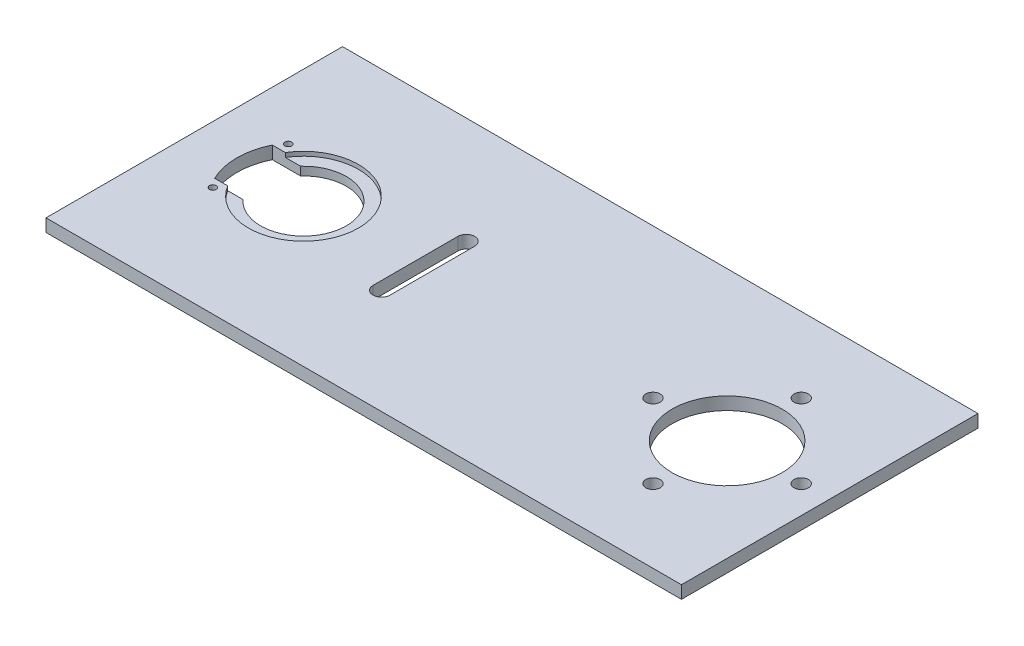
ISO-10303-21;
HEADER;
FILE_DESCRIPTION(('STEP AP214'),'2;1');
FILE_NAME('part.step','',(''),(''),'','','');
FILE_SCHEMA(('AUTOMOTIVE_DESIGN { 1 0 10303 214 1 1 1 1 }'));
ENDSEC;
DATA;
#1=APPLICATION_CONTEXT('core data for automotive mechanical design processes');
#2=APPLICATION_PROTOCOL_DEFINITION('international standard','automotive_design',2000,#1);
#3=PRODUCT_CONTEXT('',#1,'mechanical');
#4=PRODUCT('Part','Part','',(#3));
#5=PRODUCT_RELATED_PRODUCT_CATEGORY('part','',(#4));
#6=PRODUCT_DEFINITION_FORMATION('','',#4);
#7=PRODUCT_DEFINITION_CONTEXT('part definition',#1,'design');
#8=PRODUCT_DEFINITION('design','',#6,#7);
#9=PRODUCT_DEFINITION_SHAPE('','',#8);
#10=(LENGTH_UNIT() NAMED_UNIT(*) SI_UNIT(.MILLI.,.METRE.));
#11=(NAMED_UNIT(*) PLANE_ANGLE_UNIT() SI_UNIT($,.RADIAN.));
#12=(NAMED_UNIT(*) SI_UNIT($,.STERADIAN.) SOLID_ANGLE_UNIT());
#13=UNCERTAINTY_MEASURE_WITH_UNIT(LENGTH_MEASURE(1.E-05),#10,'distance_accuracy_value','');
#14=(GEOMETRIC_REPRESENTATION_CONTEXT(3) GLOBAL_UNCERTAINTY_ASSIGNED_CONTEXT((#13)) GLOBAL_UNIT_ASSIGNED_CONTEXT((#10,
#11,#12)) REPRESENTATION_CONTEXT('',''));
#15=CARTESIAN_POINT('',(0.,0.,0.));
#16=DIRECTION('',(0.,0.,1.));
#17=DIRECTION('',(1.,0.,0.));
#18=AXIS2_PLACEMENT_3D('',#15,#16,#17);
#19=CARTESIAN_POINT('',(25.9787595714161,0.,-34.7957353107245));
#20=DIRECTION('',(0.,1.,0.));
#21=DIRECTION('',(0.,0.,1.));
#22=AXIS2_PLACEMENT_3D('',#19,#20,#21);
#23=CYLINDRICAL_SURFACE('',#22,10.1089267481722);
#24=CARTESIAN_POINT('',(25.9787595714161,2.,-34.7957353107245));
#25=DIRECTION('',(0.,1.,0.));
#26=DIRECTION('',(0.,0.,1.));
#27=AXIS2_PLACEMENT_3D('',#24,#25,#26);
#28=CIRCLE('',#27,10.1089267481722);
#29=CARTESIAN_POINT('',(18.4987595714161,2.,-41.5957353107114));
#30=VERTEX_POINT('',#29);
#31=CARTESIAN_POINT('',(18.4987595714193,2.,-27.9957353107274));
#32=VERTEX_POINT('',#31);
#33=EDGE_CURVE('E239',#30,#32,#28,.F.);
#34=ORIENTED_EDGE('',*,*,#33,.F.);
#35=DIRECTION('',(0.,1.,0.));
#36=VECTOR('',#35,1.);
#37=CARTESIAN_POINT('',(18.4987595714161,0.,-41.5957353107114));
#38=LINE('',#37,#36);
#39=CARTESIAN_POINT('',(18.4987595714161,0.,-41.5957353107114));
#40=VERTEX_POINT('',#39);
#41=EDGE_CURVE('E192',#40,#30,#38,.T.);
#42=ORIENTED_EDGE('',*,*,#41,.F.);
#43=CARTESIAN_POINT('',(25.9787595714161,0.,-34.7957353107245));
#44=DIRECTION('',(0.,1.,0.));
#45=DIRECTION('',(0.,0.,1.));
#46=AXIS2_PLACEMENT_3D('',#43,#44,#45);
#47=CIRCLE('',#46,10.1089267481722);
#48=CARTESIAN_POINT('',(18.4987595714161,0.,-27.9957353107245));
#49=VERTEX_POINT('',#48);
#50=EDGE_CURVE('E180',#49,#40,#47,.T.);
#51=ORIENTED_EDGE('',*,*,#50,.F.);
#52=DIRECTION('',(0.,1.,0.));
#53=VECTOR('',#52,1.);
#54=CARTESIAN_POINT('',(18.4987595714161,0.,-27.9957353107245));
#55=LINE('',#54,#53);
#56=EDGE_CURVE('E181',#49,#32,#55,.T.);
#57=ORIENTED_EDGE('',*,*,#56,.T.);
#58=EDGE_LOOP('',(#34,#42,#51,#57));
#59=FACE_BOUND('',#58,.T.);
#60=ADVANCED_FACE('F39',(#59),#23,.F.);
#61=CARTESIAN_POINT('',(0.,3.,0.));
#62=DIRECTION('',(1.,0.,0.));
#63=DIRECTION('',(0.,0.,-1.));
#64=AXIS2_PLACEMENT_3D('',#61,#62,#63);
#65=PLANE('',#64);
#66=DIRECTION('',(0.,0.,1.));
#67=VECTOR('',#66,1.);
#68=CARTESIAN_POINT('',(0.,0.,0.));
#69=LINE('',#68,#67);
#70=CARTESIAN_POINT('',(0.,0.,-70.));
#71=VERTEX_POINT('',#70);
#72=CARTESIAN_POINT('',(0.,0.,0.));
#73=VERTEX_POINT('',#72);
#74=EDGE_CURVE('E185',#71,#73,#69,.T.);
#75=ORIENTED_EDGE('',*,*,#74,.T.);
#76=DIRECTION('',(0.,-1.,0.));
#77=VECTOR('',#76,1.);
#78=CARTESIAN_POINT('',(0.,3.,0.));
#79=LINE('',#78,#77);
#80=CARTESIAN_POINT('',(0.,3.,0.));
#81=VERTEX_POINT('',#80);
#82=EDGE_CURVE('E232',#81,#73,#79,.T.);
#83=ORIENTED_EDGE('',*,*,#82,.F.);
#84=DIRECTION('',(0.,0.,1.));
#85=VECTOR('',#84,1.);
#86=CARTESIAN_POINT('',(0.,3.,0.));
#87=LINE('',#86,#85);
#88=CARTESIAN_POINT('',(0.,3.,-70.));
#89=VERTEX_POINT('',#88);
#90=EDGE_CURVE('E195',#89,#81,#87,.T.);
#91=ORIENTED_EDGE('',*,*,#90,.F.);
#92=DIRECTION('',(0.,-1.,0.));
#93=VECTOR('',#92,1.);
#94=CARTESIAN_POINT('',(0.,3.,-70.));
#95=LINE('',#94,#93);
#96=EDGE_CURVE('E209',#89,#71,#95,.T.);
#97=ORIENTED_EDGE('',*,*,#96,.T.);
#98=EDGE_LOOP('',(#75,#83,#91,#97));
#99=FACE_BOUND('',#98,.T.);
#100=ADVANCED_FACE('F41',(#99),#65,.F.);
#101=CARTESIAN_POINT('',(0.,3.,0.));
#102=DIRECTION('',(0.,0.,-1.));
#103=DIRECTION('',(-1.,0.,0.));
#104=AXIS2_PLACEMENT_3D('',#101,#102,#103);
#105=PLANE('',#104);
#106=DIRECTION('',(1.,0.,0.));
#107=VECTOR('',#106,1.);
#108=CARTESIAN_POINT('',(0.,0.,0.));
#109=LINE('',#108,#107);
#110=CARTESIAN_POINT('',(150.,0.,0.));
#111=VERTEX_POINT('',#110);
#112=EDGE_CURVE('E213',#73,#111,#109,.T.);
#113=ORIENTED_EDGE('',*,*,#112,.T.);
#114=DIRECTION('',(0.,-1.,0.));
#115=VECTOR('',#114,1.);
#116=CARTESIAN_POINT('',(150.,3.,0.));
#117=LINE('',#116,#115);
#118=CARTESIAN_POINT('',(150.,3.,0.));
#119=VERTEX_POINT('',#118);
#120=EDGE_CURVE('E228',#119,#111,#117,.T.);
#121=ORIENTED_EDGE('',*,*,#120,.F.);
#122=DIRECTION('',(1.,0.,0.));
#123=VECTOR('',#122,1.);
#124=CARTESIAN_POINT('',(0.,3.,0.));
#125=LINE('',#124,#123);
#126=EDGE_CURVE('E199',#81,#119,#125,.T.);
#127=ORIENTED_EDGE('',*,*,#126,.F.);
#128=ORIENTED_EDGE('',*,*,#82,.T.);
#129=EDGE_LOOP('',(#113,#121,#127,#128));
#130=FACE_BOUND('',#129,.T.);
#131=ADVANCED_FACE('F370',(#130),#105,.F.);
#132=CARTESIAN_POINT('',(150.,3.,0.));
#133=DIRECTION('',(-1.,0.,0.));
#134=DIRECTION('',(0.,0.,1.));
#135=AXIS2_PLACEMENT_3D('',#132,#133,#134);
#136=PLANE('',#135);
#137=DIRECTION('',(0.,0.,-1.));
#138=VECTOR('',#137,1.);
#139=CARTESIAN_POINT('',(150.,0.,0.));
#140=LINE('',#139,#138);
#141=CARTESIAN_POINT('',(150.,0.,-70.));
#142=VERTEX_POINT('',#141);
#143=EDGE_CURVE('E216',#111,#142,#140,.T.);
#144=ORIENTED_EDGE('',*,*,#143,.T.);
#145=DIRECTION('',(0.,-1.,0.));
#146=VECTOR('',#145,1.);
#147=CARTESIAN_POINT('',(150.,3.,-70.));
#148=LINE('',#147,#146);
#149=CARTESIAN_POINT('',(150.,3.,-70.));
#150=VERTEX_POINT('',#149);
#151=EDGE_CURVE('E224',#150,#142,#148,.T.);
#152=ORIENTED_EDGE('',*,*,#151,.F.);
#153=DIRECTION('',(0.,0.,-1.));
#154=VECTOR('',#153,1.);
#155=CARTESIAN_POINT('',(150.,3.,0.));
#156=LINE('',#155,#154);
#157=EDGE_CURVE('E203',#119,#150,#156,.T.);
#158=ORIENTED_EDGE('',*,*,#157,.F.);
#159=ORIENTED_EDGE('',*,*,#120,.T.);
#160=EDGE_LOOP('',(#144,#152,#158,#159));
#161=FACE_BOUND('',#160,.T.);
#162=ADVANCED_FACE('F379',(#161),#136,.F.);
#163=CARTESIAN_POINT('',(0.,3.,-70.));
#164=DIRECTION('',(0.,0.,1.));
#165=DIRECTION('',(1.,0.,0.));
#166=AXIS2_PLACEMENT_3D('',#163,#164,#165);
#167=PLANE('',#166);
#168=DIRECTION('',(-1.,0.,0.));
#169=VECTOR('',#168,1.);
#170=CARTESIAN_POINT('',(0.,0.,-70.));
#171=LINE('',#170,#169);
#172=EDGE_CURVE('E200',#142,#71,#171,.T.);
#173=ORIENTED_EDGE('',*,*,#172,.T.);
#174=ORIENTED_EDGE('',*,*,#96,.F.);
#175=DIRECTION('',(-1.,0.,0.));
#176=VECTOR('',#175,1.);
#177=CARTESIAN_POINT('',(0.,3.,-70.));
#178=LINE('',#177,#176);
#179=EDGE_CURVE('E206',#150,#89,#178,.T.);
#180=ORIENTED_EDGE('',*,*,#179,.F.);
#181=ORIENTED_EDGE('',*,*,#151,.T.);
#182=EDGE_LOOP('',(#173,#174,#180,#181));
#183=FACE_BOUND('',#182,.T.);
#184=ADVANCED_FACE('F340',(#183),#167,.F.);
#185=CARTESIAN_POINT('',(0.,3.,0.));
#186=DIRECTION('',(0.,-1.,0.));
#187=DIRECTION('',(0.,0.,-1.));
#188=AXIS2_PLACEMENT_3D('',#185,#186,#187);
#189=PLANE('',#188);
#190=CARTESIAN_POINT('',(125.978759571404,3.,-52.2957353107179));
#191=DIRECTION('',(0.,1.,0.));
#192=DIRECTION('',(0.,0.,1.));
#193=AXIS2_PLACEMENT_3D('',#190,#191,#192);
#194=CIRCLE('',#193,1.70000000000001);
#195=CARTESIAN_POINT('',(125.978759571404,3.,-50.5957353107179));
#196=VERTEX_POINT('',#195);
#197=EDGE_CURVE('E498',#196,#196,#194,.T.);
#198=ORIENTED_EDGE('',*,*,#197,.F.);
#199=EDGE_LOOP('',(#198));
#200=FACE_BOUND('',#199,.T.);
#201=CARTESIAN_POINT('',(108.478759571404,3.,-34.7957353107179));
#202=DIRECTION('',(0.,1.,0.));
#203=DIRECTION('',(0.,0.,1.));
#204=AXIS2_PLACEMENT_3D('',#201,#202,#203);
#205=CIRCLE('',#204,1.69999999999999);
#206=CARTESIAN_POINT('',(108.478759571404,3.,-33.0957353107179));
#207=VERTEX_POINT('',#206);
#208=EDGE_CURVE('E502',#207,#207,#205,.T.);
#209=ORIENTED_EDGE('',*,*,#208,.F.);
#210=EDGE_LOOP('',(#209));
#211=FACE_BOUND('',#210,.T.);
#212=CARTESIAN_POINT('',(125.978759571404,3.,-17.2957353107179));
#213=DIRECTION('',(0.,1.,0.));
#214=DIRECTION('',(0.,0.,1.));
#215=AXIS2_PLACEMENT_3D('',#212,#213,#214);
#216=CIRCLE('',#215,1.70000000000001);
#217=CARTESIAN_POINT('',(125.978759571404,3.,-15.5957353107179));
#218=VERTEX_POINT('',#217);
#219=EDGE_CURVE('E512',#218,#218,#216,.T.);
#220=ORIENTED_EDGE('',*,*,#219,.F.);
#221=EDGE_LOOP('',(#220));
#222=FACE_BOUND('',#221,.T.);
#223=CARTESIAN_POINT('',(143.478759571404,3.,-34.7957353107179));
#224=DIRECTION('',(0.,1.,0.));
#225=DIRECTION('',(0.,0.,1.));
#226=AXIS2_PLACEMENT_3D('',#223,#224,#225);
#227=CIRCLE('',#226,1.70000000000001);
#228=CARTESIAN_POINT('',(143.478759571404,3.,-33.0957353107179));
#229=VERTEX_POINT('',#228);
#230=EDGE_CURVE('E516',#229,#229,#227,.T.);
#231=ORIENTED_EDGE('',*,*,#230,.F.);
#232=EDGE_LOOP('',(#231));
#233=FACE_BOUND('',#232,.T.);
#234=CARTESIAN_POINT('',(13.4987595714161,3.,-25.8957353107245));
#235=DIRECTION('',(0.,1.,0.));
#236=DIRECTION('',(0.,0.,-1.));
#237=AXIS2_PLACEMENT_3D('',#234,#235,#236);
#238=CIRCLE('',#237,0.800000000000006);
#239=CARTESIAN_POINT('',(13.4987595714161,3.,-26.6957353107245));
#240=VERTEX_POINT('',#239);
#241=EDGE_CURVE('E262',#240,#240,#238,.T.);
#242=ORIENTED_EDGE('',*,*,#241,.F.);
#243=EDGE_LOOP('',(#242));
#244=FACE_BOUND('',#243,.T.);
#245=CARTESIAN_POINT('',(13.4987595714161,3.,-43.6957353107114));
#246=DIRECTION('',(0.,1.,0.));
#247=DIRECTION('',(0.,0.,1.));
#248=AXIS2_PLACEMENT_3D('',#245,#246,#247);
#249=CIRCLE('',#248,0.800000000000006);
#250=CARTESIAN_POINT('',(13.4987595714161,3.,-42.8957353107114));
#251=VERTEX_POINT('',#250);
#252=EDGE_CURVE('E324',#251,#251,#249,.T.);
#253=ORIENTED_EDGE('',*,*,#252,.F.);
#254=EDGE_LOOP('',(#253));
#255=FACE_BOUND('',#254,.T.);
#256=DIRECTION('',(0.,0.,1.));
#257=VECTOR('',#256,1.);
#258=CARTESIAN_POINT('',(52.40419960801,3.,-44.7957353107179));
#259=LINE('',#258,#257);
#260=CARTESIAN_POINT('',(52.40419960801,3.,-44.7957353107179));
#261=VERTEX_POINT('',#260);
#262=CARTESIAN_POINT('',(52.40419960801,3.,-24.7957353107179));
#263=VERTEX_POINT('',#262);
#264=EDGE_CURVE('E299',#261,#263,#259,.T.);
#265=ORIENTED_EDGE('',*,*,#264,.F.);
#266=CARTESIAN_POINT('',(54.40419960801,3.,-44.7957353107179));
#267=DIRECTION('',(0.,1.,0.));
#268=DIRECTION('',(0.,0.,1.));
#269=AXIS2_PLACEMENT_3D('',#266,#267,#268);
#270=CIRCLE('',#269,2.);
#271=CARTESIAN_POINT('',(56.40419960801,3.,-44.7957353107179));
#272=VERTEX_POINT('',#271);
#273=EDGE_CURVE('E64',#272,#261,#270,.T.);
#274=ORIENTED_EDGE('',*,*,#273,.F.);
#275=DIRECTION('',(0.,0.,-1.));
#276=VECTOR('',#275,1.);
#277=CARTESIAN_POINT('',(56.40419960801,3.,-44.7957353107179));
#278=LINE('',#277,#276);
#279=CARTESIAN_POINT('',(56.40419960801,3.,-24.7957353107179));
#280=VERTEX_POINT('',#279);
#281=EDGE_CURVE('E284',#280,#272,#278,.T.);
#282=ORIENTED_EDGE('',*,*,#281,.F.);
#283=CARTESIAN_POINT('',(54.40419960801,3.,-24.7957353107179));
#284=DIRECTION('',(0.,1.,0.));
#285=DIRECTION('',(0.,0.,1.));
#286=AXIS2_PLACEMENT_3D('',#283,#284,#285);
#287=CIRCLE('',#286,2.);
#288=EDGE_CURVE('E304',#263,#280,#287,.T.);
#289=ORIENTED_EDGE('',*,*,#288,.F.);
#290=EDGE_LOOP('',(#265,#274,#282,#289));
#291=FACE_BOUND('',#290,.T.);
#292=CARTESIAN_POINT('',(125.978759571404,3.,-34.7957353107179));
#293=DIRECTION('',(0.,1.,0.));
#294=DIRECTION('',(0.,0.,1.));
#295=AXIS2_PLACEMENT_3D('',#292,#293,#294);
#296=CIRCLE('',#295,13.);
#297=CARTESIAN_POINT('',(125.978759571404,3.,-21.7957353107179));
#298=VERTEX_POINT('',#297);
#299=EDGE_CURVE('E172',#298,#298,#296,.T.);
#300=ORIENTED_EDGE('',*,*,#299,.F.);
#301=EDGE_LOOP('',(#300));
#302=FACE_BOUND('',#301,.T.);
#303=DIRECTION('',(-1.,0.,0.));
#304=VECTOR('',#303,1.);
#305=CARTESIAN_POINT('',(18.4987595714161,3.,-41.5957353107114));
#306=LINE('',#305,#304);
#307=CARTESIAN_POINT('',(14.8990483838364,3.,-41.5957353107114));
#308=VERTEX_POINT('',#307);
#309=CARTESIAN_POINT('',(11.8280157376589,3.,-41.5957353107114));
#310=VERTEX_POINT('',#309);
#311=EDGE_CURVE('E156',#308,#310,#306,.T.);
#312=ORIENTED_EDGE('',*,*,#311,.F.);
#313=CARTESIAN_POINT('',(25.9787595714161,3.,-34.7957353107245));
#314=DIRECTION('',(0.,1.,0.));
#315=DIRECTION('',(0.,0.,1.));
#316=AXIS2_PLACEMENT_3D('',#313,#314,#315);
#317=CIRCLE('',#316,13.);
#318=CARTESIAN_POINT('',(14.8990483838445,3.,-27.9957353107245));
#319=VERTEX_POINT('',#318);
#320=EDGE_CURVE('E141',#319,#308,#317,.T.);
#321=ORIENTED_EDGE('',*,*,#320,.F.);
#322=DIRECTION('',(1.,0.,0.));
#323=VECTOR('',#322,1.);
#324=CARTESIAN_POINT('',(18.4987595714161,3.,-27.9957353107245));
#325=LINE('',#324,#323);
#326=CARTESIAN_POINT('',(11.8280157376589,3.,-27.9957353107244));
#327=VERTEX_POINT('',#326);
#328=EDGE_CURVE('E169',#327,#319,#325,.T.);
#329=ORIENTED_EDGE('',*,*,#328,.F.);
#330=CARTESIAN_POINT('',(25.7567629892997,3.,-34.7957353107179));
#331=DIRECTION('',(0.,1.,0.));
#332=DIRECTION('',(0.,0.,1.));
#333=AXIS2_PLACEMENT_3D('',#330,#331,#332);
#334=CIRCLE('',#333,15.5000000000001);
#335=EDGE_CURVE('E163',#310,#327,#334,.T.);
#336=ORIENTED_EDGE('',*,*,#335,.F.);
#337=EDGE_LOOP('',(#312,#321,#329,#336));
#338=FACE_BOUND('',#337,.T.);
#339=ORIENTED_EDGE('',*,*,#90,.T.);
#340=ORIENTED_EDGE('',*,*,#126,.T.);
#341=ORIENTED_EDGE('',*,*,#157,.T.);
#342=ORIENTED_EDGE('',*,*,#179,.T.);
#343=EDGE_LOOP('',(#339,#340,#341,#342));
#344=FACE_BOUND('',#343,.T.);
#345=ADVANCED_FACE('F160',(#200,#211,#222,#233,#244,#255,#291,#302,#338,#344),#189,.F.);
#346=CARTESIAN_POINT('',(0.,0.,0.));
#347=DIRECTION('',(0.,-1.,0.));
#348=DIRECTION('',(0.,0.,-1.));
#349=AXIS2_PLACEMENT_3D('',#346,#347,#348);
#350=PLANE('',#349);
#351=CARTESIAN_POINT('',(125.978759571404,0.,-52.2957353107179));
#352=DIRECTION('',(0.,-1.,0.));
#353=DIRECTION('',(0.,0.,-1.));
#354=AXIS2_PLACEMENT_3D('',#351,#352,#353);
#355=CIRCLE('',#354,1.70000000000001);
#356=CARTESIAN_POINT('',(125.978759571404,0.,-53.9957353107179));
#357=VERTEX_POINT('',#356);
#358=EDGE_CURVE('E495',#357,#357,#355,.T.);
#359=ORIENTED_EDGE('',*,*,#358,.F.);
#360=EDGE_LOOP('',(#359));
#361=FACE_BOUND('',#360,.T.);
#362=CARTESIAN_POINT('',(108.478759571404,0.,-34.7957353107179));
#363=DIRECTION('',(0.,-1.,0.));
#364=DIRECTION('',(0.,0.,-1.));
#365=AXIS2_PLACEMENT_3D('',#362,#363,#364);
#366=CIRCLE('',#365,1.69999999999999);
#367=CARTESIAN_POINT('',(108.478759571404,0.,-36.4957353107179));
#368=VERTEX_POINT('',#367);
#369=EDGE_CURVE('E508',#368,#368,#366,.T.);
#370=ORIENTED_EDGE('',*,*,#369,.F.);
#371=EDGE_LOOP('',(#370));
#372=FACE_BOUND('',#371,.T.);
#373=CARTESIAN_POINT('',(125.978759571404,0.,-17.2957353107179));
#374=DIRECTION('',(0.,-1.,0.));
#375=DIRECTION('',(0.,0.,-1.));
#376=AXIS2_PLACEMENT_3D('',#373,#374,#375);
#377=CIRCLE('',#376,1.70000000000001);
#378=CARTESIAN_POINT('',(125.978759571404,0.,-18.9957353107179));
#379=VERTEX_POINT('',#378);
#380=EDGE_CURVE('E43',#379,#379,#377,.T.);
#381=ORIENTED_EDGE('',*,*,#380,.F.);
#382=EDGE_LOOP('',(#381));
#383=FACE_BOUND('',#382,.T.);
#384=CARTESIAN_POINT('',(143.478759571404,0.,-34.7957353107179));
#385=DIRECTION('',(0.,-1.,0.));
#386=DIRECTION('',(0.,0.,-1.));
#387=AXIS2_PLACEMENT_3D('',#384,#385,#386);
#388=CIRCLE('',#387,1.70000000000001);
#389=CARTESIAN_POINT('',(143.478759571404,0.,-36.4957353107179));
#390=VERTEX_POINT('',#389);
#391=EDGE_CURVE('E151',#390,#390,#388,.T.);
#392=ORIENTED_EDGE('',*,*,#391,.F.);
#393=EDGE_LOOP('',(#392));
#394=FACE_BOUND('',#393,.T.);
#395=CARTESIAN_POINT('',(13.4987595714161,0.,-25.8957353107245));
#396=DIRECTION('',(0.,1.,0.));
#397=DIRECTION('',(0.,0.,-1.));
#398=AXIS2_PLACEMENT_3D('',#395,#396,#397);
#399=CIRCLE('',#398,0.800000000000006);
#400=CARTESIAN_POINT('',(13.4987595714161,0.,-26.6957353107245));
#401=VERTEX_POINT('',#400);
#402=EDGE_CURVE('E327',#401,#401,#399,.T.);
#403=ORIENTED_EDGE('',*,*,#402,.T.);
#404=EDGE_LOOP('',(#403));
#405=FACE_BOUND('',#404,.T.);
#406=CARTESIAN_POINT('',(13.4987595714161,0.,-43.6957353107114));
#407=DIRECTION('',(0.,1.,0.));
#408=DIRECTION('',(0.,0.,1.));
#409=AXIS2_PLACEMENT_3D('',#406,#407,#408);
#410=CIRCLE('',#409,0.800000000000006);
#411=CARTESIAN_POINT('',(13.4987595714161,0.,-42.8957353107114));
#412=VERTEX_POINT('',#411);
#413=EDGE_CURVE('E300',#412,#412,#410,.T.);
#414=ORIENTED_EDGE('',*,*,#413,.T.);
#415=EDGE_LOOP('',(#414));
#416=FACE_BOUND('',#415,.T.);
#417=CARTESIAN_POINT('',(54.40419960801,0.,-44.7957353107179));
#418=DIRECTION('',(0.,1.,0.));
#419=DIRECTION('',(0.,0.,1.));
#420=AXIS2_PLACEMENT_3D('',#417,#418,#419);
#421=CIRCLE('',#420,2.);
#422=CARTESIAN_POINT('',(56.40419960801,0.,-44.7957353107179));
#423=VERTEX_POINT('',#422);
#424=CARTESIAN_POINT('',(52.40419960801,0.,-44.7957353107179));
#425=VERTEX_POINT('',#424);
#426=EDGE_CURVE('E279',#423,#425,#421,.T.);
#427=ORIENTED_EDGE('',*,*,#426,.T.);
#428=DIRECTION('',(0.,0.,1.));
#429=VECTOR('',#428,1.);
#430=CARTESIAN_POINT('',(52.40419960801,0.,-44.7957353107179));
#431=LINE('',#430,#429);
#432=CARTESIAN_POINT('',(52.40419960801,0.,-24.7957353107179));
#433=VERTEX_POINT('',#432);
#434=EDGE_CURVE('E283',#425,#433,#431,.T.);
#435=ORIENTED_EDGE('',*,*,#434,.T.);
#436=CARTESIAN_POINT('',(54.40419960801,0.,-24.7957353107179));
#437=DIRECTION('',(0.,1.,0.));
#438=DIRECTION('',(0.,0.,1.));
#439=AXIS2_PLACEMENT_3D('',#436,#437,#438);
#440=CIRCLE('',#439,2.);
#441=CARTESIAN_POINT('',(56.40419960801,0.,-24.7957353107179));
#442=VERTEX_POINT('',#441);
#443=EDGE_CURVE('E288',#433,#442,#440,.T.);
#444=ORIENTED_EDGE('',*,*,#443,.T.);
#445=DIRECTION('',(0.,0.,-1.));
#446=VECTOR('',#445,1.);
#447=CARTESIAN_POINT('',(56.40419960801,0.,-44.7957353107179));
#448=LINE('',#447,#446);
#449=EDGE_CURVE('E292',#442,#423,#448,.T.);
#450=ORIENTED_EDGE('',*,*,#449,.T.);
#451=EDGE_LOOP('',(#427,#435,#444,#450));
#452=FACE_BOUND('',#451,.T.);
#453=CARTESIAN_POINT('',(125.978759571404,0.,-34.7957353107179));
#454=DIRECTION('',(0.,1.,0.));
#455=DIRECTION('',(0.,0.,1.));
#456=AXIS2_PLACEMENT_3D('',#453,#454,#455);
#457=CIRCLE('',#456,13.);
#458=CARTESIAN_POINT('',(125.978759571404,0.,-21.7957353107179));
#459=VERTEX_POINT('',#458);
#460=EDGE_CURVE('E165',#459,#459,#457,.T.);
#461=ORIENTED_EDGE('',*,*,#460,.T.);
#462=EDGE_LOOP('',(#461));
#463=FACE_BOUND('',#462,.T.);
#464=ORIENTED_EDGE('',*,*,#50,.T.);
#465=DIRECTION('',(-1.,0.,0.));
#466=VECTOR('',#465,1.);
#467=CARTESIAN_POINT('',(18.4987595714161,0.,-41.5957353107114));
#468=LINE('',#467,#466);
#469=CARTESIAN_POINT('',(11.8280157376589,0.,-41.5957353107114));
#470=VERTEX_POINT('',#469);
#471=EDGE_CURVE('E248',#40,#470,#468,.T.);
#472=ORIENTED_EDGE('',*,*,#471,.T.);
#473=CARTESIAN_POINT('',(25.7567629892997,0.,-34.7957353107179));
#474=DIRECTION('',(0.,1.,0.));
#475=DIRECTION('',(0.,0.,1.));
#476=AXIS2_PLACEMENT_3D('',#473,#474,#475);
#477=CIRCLE('',#476,15.5000000000001);
#478=CARTESIAN_POINT('',(11.8280157376589,0.,-27.9957353107244));
#479=VERTEX_POINT('',#478);
#480=EDGE_CURVE('E253',#470,#479,#477,.T.);
#481=ORIENTED_EDGE('',*,*,#480,.T.);
#482=DIRECTION('',(1.,0.,0.));
#483=VECTOR('',#482,1.);
#484=CARTESIAN_POINT('',(18.4987595714161,0.,-27.9957353107245));
#485=LINE('',#484,#483);
#486=EDGE_CURVE('E175',#479,#49,#485,.T.);
#487=ORIENTED_EDGE('',*,*,#486,.T.);
#488=EDGE_LOOP('',(#464,#472,#481,#487));
#489=FACE_BOUND('',#488,.T.);
#490=ORIENTED_EDGE('',*,*,#74,.F.);
#491=ORIENTED_EDGE('',*,*,#172,.F.);
#492=ORIENTED_EDGE('',*,*,#143,.F.);
#493=ORIENTED_EDGE('',*,*,#112,.F.);
#494=EDGE_LOOP('',(#490,#491,#492,#493));
#495=FACE_BOUND('',#494,.T.);
#496=ADVANCED_FACE('F256',(#361,#372,#383,#394,#405,#416,#452,#463,#489,#495),#350,.T.);
#497=CARTESIAN_POINT('',(18.4987595714161,0.,-27.9957353107245));
#498=DIRECTION('',(0.,0.,1.));
#499=DIRECTION('',(1.,0.,0.));
#500=AXIS2_PLACEMENT_3D('',#497,#498,#499);
#501=PLANE('',#500);
#502=ORIENTED_EDGE('',*,*,#328,.T.);
#503=DIRECTION('',(0.,1.,0.));
#504=VECTOR('',#503,1.);
#505=CARTESIAN_POINT('',(14.8990483838445,2.,-27.9957353107245));
#506=LINE('',#505,#504);
#507=CARTESIAN_POINT('',(14.8990483838445,2.,-27.9957353107245));
#508=VERTEX_POINT('',#507);
#509=EDGE_CURVE('E145',#319,#508,#506,.F.);
#510=ORIENTED_EDGE('',*,*,#509,.T.);
#511=DIRECTION('',(-1.,0.,0.));
#512=VECTOR('',#511,1.);
#513=CARTESIAN_POINT('',(18.4987595714161,2.,-27.9957353107245));
#514=LINE('',#513,#512);
#515=EDGE_CURVE('E245',#32,#508,#514,.T.);
#516=ORIENTED_EDGE('',*,*,#515,.F.);
#517=ORIENTED_EDGE('',*,*,#56,.F.);
#518=ORIENTED_EDGE('',*,*,#486,.F.);
#519=DIRECTION('',(0.,1.,0.));
#520=VECTOR('',#519,1.);
#521=CARTESIAN_POINT('',(11.8280157376589,0.,-27.9957353107244));
#522=LINE('',#521,#520);
#523=EDGE_CURVE('E186',#479,#327,#522,.T.);
#524=ORIENTED_EDGE('',*,*,#523,.T.);
#525=EDGE_LOOP('',(#502,#510,#516,#517,#518,#524));
#526=FACE_BOUND('',#525,.T.);
#527=ADVANCED_FACE('F269',(#526),#501,.F.);
#528=CARTESIAN_POINT('',(25.7567629892997,0.,-34.7957353107179));
#529=DIRECTION('',(0.,1.,0.));
#530=DIRECTION('',(0.,0.,1.));
#531=AXIS2_PLACEMENT_3D('',#528,#529,#530);
#532=CYLINDRICAL_SURFACE('',#531,15.5000000000001);
#533=ORIENTED_EDGE('',*,*,#335,.T.);
#534=ORIENTED_EDGE('',*,*,#523,.F.);
#535=ORIENTED_EDGE('',*,*,#480,.F.);
#536=DIRECTION('',(0.,1.,0.));
#537=VECTOR('',#536,1.);
#538=CARTESIAN_POINT('',(11.8280157376589,0.,-41.5957353107114));
#539=LINE('',#538,#537);
#540=EDGE_CURVE('E189',#470,#310,#539,.T.);
#541=ORIENTED_EDGE('',*,*,#540,.T.);
#542=EDGE_LOOP('',(#533,#534,#535,#541));
#543=FACE_BOUND('',#542,.T.);
#544=ADVANCED_FACE('F267',(#543),#532,.F.);
#545=CARTESIAN_POINT('',(18.4987595714161,0.,-41.5957353107114));
#546=DIRECTION('',(0.,0.,-1.));
#547=DIRECTION('',(-1.,0.,0.));
#548=AXIS2_PLACEMENT_3D('',#545,#546,#547);
#549=PLANE('',#548);
#550=DIRECTION('',(1.,0.,0.));
#551=VECTOR('',#550,1.);
#552=CARTESIAN_POINT('',(18.4987595714161,2.,-41.5957353107114));
#553=LINE('',#552,#551);
#554=CARTESIAN_POINT('',(14.8990483838364,2.,-41.5957353107114));
#555=VERTEX_POINT('',#554);
#556=EDGE_CURVE('E49',#555,#30,#553,.T.);
#557=ORIENTED_EDGE('',*,*,#556,.F.);
#558=DIRECTION('',(0.,1.,0.));
#559=VECTOR('',#558,1.);
#560=CARTESIAN_POINT('',(14.8990483838364,2.,-41.5957353107114));
#561=LINE('',#560,#559);
#562=EDGE_CURVE('E11',#555,#308,#561,.T.);
#563=ORIENTED_EDGE('',*,*,#562,.T.);
#564=ORIENTED_EDGE('',*,*,#311,.T.);
#565=ORIENTED_EDGE('',*,*,#540,.F.);
#566=ORIENTED_EDGE('',*,*,#471,.F.);
#567=ORIENTED_EDGE('',*,*,#41,.T.);
#568=EDGE_LOOP('',(#557,#563,#564,#565,#566,#567));
#569=FACE_BOUND('',#568,.T.);
#570=ADVANCED_FACE('F154',(#569),#549,.F.);
#571=CARTESIAN_POINT('',(125.978759571404,0.,-34.7957353107179));
#572=DIRECTION('',(0.,1.,0.));
#573=DIRECTION('',(0.,0.,1.));
#574=AXIS2_PLACEMENT_3D('',#571,#572,#573);
#575=CYLINDRICAL_SURFACE('',#574,13.);
#576=ORIENTED_EDGE('',*,*,#460,.F.);
#577=EDGE_LOOP('',(#576));
#578=FACE_BOUND('',#577,.T.);
#579=ORIENTED_EDGE('',*,*,#299,.T.);
#580=EDGE_LOOP('',(#579));
#581=FACE_BOUND('',#580,.T.);
#582=ADVANCED_FACE('F350',(#578,#581),#575,.F.);
#583=CARTESIAN_POINT('',(54.40419960801,0.,-44.7957353107179));
#584=DIRECTION('',(0.,1.,0.));
#585=DIRECTION('',(0.,0.,1.));
#586=AXIS2_PLACEMENT_3D('',#583,#584,#585);
#587=CYLINDRICAL_SURFACE('',#586,2.);
#588=ORIENTED_EDGE('',*,*,#273,.T.);
#589=DIRECTION('',(0.,1.,0.));
#590=VECTOR('',#589,1.);
#591=CARTESIAN_POINT('',(52.40419960801,0.,-44.7957353107179));
#592=LINE('',#591,#590);
#593=EDGE_CURVE('E296',#425,#261,#592,.T.);
#594=ORIENTED_EDGE('',*,*,#593,.F.);
#595=ORIENTED_EDGE('',*,*,#426,.F.);
#596=DIRECTION('',(0.,1.,0.));
#597=VECTOR('',#596,1.);
#598=CARTESIAN_POINT('',(56.40419960801,0.,-44.7957353107179));
#599=LINE('',#598,#597);
#600=EDGE_CURVE('E278',#423,#272,#599,.T.);
#601=ORIENTED_EDGE('',*,*,#600,.T.);
#602=EDGE_LOOP('',(#588,#594,#595,#601));
#603=FACE_BOUND('',#602,.T.);
#604=ADVANCED_FACE('F352',(#603),#587,.F.);
#605=CARTESIAN_POINT('',(56.40419960801,0.,-44.7957353107179));
#606=DIRECTION('',(1.,0.,0.));
#607=DIRECTION('',(0.,0.,-1.));
#608=AXIS2_PLACEMENT_3D('',#605,#606,#607);
#609=PLANE('',#608);
#610=ORIENTED_EDGE('',*,*,#281,.T.);
#611=ORIENTED_EDGE('',*,*,#600,.F.);
#612=ORIENTED_EDGE('',*,*,#449,.F.);
#613=DIRECTION('',(0.,1.,0.));
#614=VECTOR('',#613,1.);
#615=CARTESIAN_POINT('',(56.40419960801,0.,-24.7957353107179));
#616=LINE('',#615,#614);
#617=EDGE_CURVE('E313',#442,#280,#616,.T.);
#618=ORIENTED_EDGE('',*,*,#617,.T.);
#619=EDGE_LOOP('',(#610,#611,#612,#618));
#620=FACE_BOUND('',#619,.T.);
#621=ADVANCED_FACE('F359',(#620),#609,.F.);
#622=CARTESIAN_POINT('',(54.40419960801,0.,-24.7957353107179));
#623=DIRECTION('',(0.,1.,0.));
#624=DIRECTION('',(0.,0.,1.));
#625=AXIS2_PLACEMENT_3D('',#622,#623,#624);
#626=CYLINDRICAL_SURFACE('',#625,2.);
#627=ORIENTED_EDGE('',*,*,#288,.T.);
#628=ORIENTED_EDGE('',*,*,#617,.F.);
#629=ORIENTED_EDGE('',*,*,#443,.F.);
#630=DIRECTION('',(0.,1.,0.));
#631=VECTOR('',#630,1.);
#632=CARTESIAN_POINT('',(52.40419960801,0.,-24.7957353107179));
#633=LINE('',#632,#631);
#634=EDGE_CURVE('E316',#433,#263,#633,.T.);
#635=ORIENTED_EDGE('',*,*,#634,.T.);
#636=EDGE_LOOP('',(#627,#628,#629,#635));
#637=FACE_BOUND('',#636,.T.);
#638=ADVANCED_FACE('F542',(#637),#626,.F.);
#639=CARTESIAN_POINT('',(52.40419960801,0.,-44.7957353107179));
#640=DIRECTION('',(-1.,0.,0.));
#641=DIRECTION('',(0.,0.,1.));
#642=AXIS2_PLACEMENT_3D('',#639,#640,#641);
#643=PLANE('',#642);
#644=ORIENTED_EDGE('',*,*,#264,.T.);
#645=ORIENTED_EDGE('',*,*,#634,.F.);
#646=ORIENTED_EDGE('',*,*,#434,.F.);
#647=ORIENTED_EDGE('',*,*,#593,.T.);
#648=EDGE_LOOP('',(#644,#645,#646,#647));
#649=FACE_BOUND('',#648,.T.);
#650=ADVANCED_FACE('F540',(#649),#643,.F.);
#651=CARTESIAN_POINT('',(13.4987595714161,0.,-43.6957353107114));
#652=DIRECTION('',(0.,1.,0.));
#653=DIRECTION('',(0.,0.,1.));
#654=AXIS2_PLACEMENT_3D('',#651,#652,#653);
#655=CYLINDRICAL_SURFACE('',#654,0.800000000000006);
#656=ORIENTED_EDGE('',*,*,#413,.F.);
#657=EDGE_LOOP('',(#656));
#658=FACE_BOUND('',#657,.T.);
#659=ORIENTED_EDGE('',*,*,#252,.T.);
#660=EDGE_LOOP('',(#659));
#661=FACE_BOUND('',#660,.T.);
#662=ADVANCED_FACE('F552',(#658,#661),#655,.F.);
#663=CARTESIAN_POINT('',(13.4987595714161,0.,-25.8957353107245));
#664=DIRECTION('',(0.,1.,0.));
#665=DIRECTION('',(0.,0.,1.));
#666=AXIS2_PLACEMENT_3D('',#663,#664,#665);
#667=CYLINDRICAL_SURFACE('',#666,0.800000000000006);
#668=ORIENTED_EDGE('',*,*,#402,.F.);
#669=EDGE_LOOP('',(#668));
#670=FACE_BOUND('',#669,.T.);
#671=ORIENTED_EDGE('',*,*,#241,.T.);
#672=EDGE_LOOP('',(#671));
#673=FACE_BOUND('',#672,.T.);
#674=ADVANCED_FACE('F336',(#670,#673),#667,.F.);
#675=CARTESIAN_POINT('',(25.9787595714161,2.,-34.7957353107245));
#676=DIRECTION('',(0.,1.,0.));
#677=DIRECTION('',(0.,0.,1.));
#678=AXIS2_PLACEMENT_3D('',#675,#676,#677);
#679=CYLINDRICAL_SURFACE('',#678,13.);
#680=ORIENTED_EDGE('',*,*,#320,.T.);
#681=ORIENTED_EDGE('',*,*,#562,.F.);
#682=CARTESIAN_POINT('',(25.9787595714161,2.,-34.7957353107245));
#683=DIRECTION('',(0.,1.,0.));
#684=DIRECTION('',(0.,0.,1.));
#685=AXIS2_PLACEMENT_3D('',#682,#683,#684);
#686=CIRCLE('',#685,13.);
#687=EDGE_CURVE('E56',#508,#555,#686,.T.);
#688=ORIENTED_EDGE('',*,*,#687,.F.);
#689=ORIENTED_EDGE('',*,*,#509,.F.);
#690=EDGE_LOOP('',(#680,#681,#688,#689));
#691=FACE_BOUND('',#690,.T.);
#692=ADVANCED_FACE('F142',(#691),#679,.F.);
#693=CARTESIAN_POINT('',(25.9787595714161,2.,-34.7957353107245));
#694=DIRECTION('',(0.,1.,0.));
#695=DIRECTION('',(0.,0.,1.));
#696=AXIS2_PLACEMENT_3D('',#693,#694,#695);
#697=PLANE('',#696);
#698=ORIENTED_EDGE('',*,*,#515,.T.);
#699=ORIENTED_EDGE('',*,*,#687,.T.);
#700=ORIENTED_EDGE('',*,*,#556,.T.);
#701=ORIENTED_EDGE('',*,*,#33,.T.);
#702=EDGE_LOOP('',(#698,#699,#700,#701));
#703=FACE_BOUND('',#702,.T.);
#704=ADVANCED_FACE('F238',(#703),#697,.T.);
#705=CARTESIAN_POINT('',(143.478759571404,3.,-34.7957353107179));
#706=DIRECTION('',(0.,1.,0.));
#707=DIRECTION('',(0.,0.,1.));
#708=AXIS2_PLACEMENT_3D('',#705,#706,#707);
#709=CYLINDRICAL_SURFACE('',#708,1.70000000000001);
#710=ORIENTED_EDGE('',*,*,#391,.T.);
#711=EDGE_LOOP('',(#710));
#712=FACE_BOUND('',#711,.T.);
#713=ORIENTED_EDGE('',*,*,#230,.T.);
#714=EDGE_LOOP('',(#713));
#715=FACE_BOUND('',#714,.T.);
#716=ADVANCED_FACE('F449',(#712,#715),#709,.F.);
#717=CARTESIAN_POINT('',(125.978759571404,3.,-17.2957353107179));
#718=DIRECTION('',(0.,1.,0.));
#719=DIRECTION('',(0.,0.,1.));
#720=AXIS2_PLACEMENT_3D('',#717,#718,#719);
#721=CYLINDRICAL_SURFACE('',#720,1.70000000000001);
#722=ORIENTED_EDGE('',*,*,#380,.T.);
#723=EDGE_LOOP('',(#722));
#724=FACE_BOUND('',#723,.T.);
#725=ORIENTED_EDGE('',*,*,#219,.T.);
#726=EDGE_LOOP('',(#725));
#727=FACE_BOUND('',#726,.T.);
#728=ADVANCED_FACE('F458',(#724,#727),#721,.F.);
#729=CARTESIAN_POINT('',(108.478759571404,3.,-34.7957353107179));
#730=DIRECTION('',(0.,1.,0.));
#731=DIRECTION('',(0.,0.,1.));
#732=AXIS2_PLACEMENT_3D('',#729,#730,#731);
#733=CYLINDRICAL_SURFACE('',#732,1.69999999999999);
#734=ORIENTED_EDGE('',*,*,#369,.T.);
#735=EDGE_LOOP('',(#734));
#736=FACE_BOUND('',#735,.T.);
#737=ORIENTED_EDGE('',*,*,#208,.T.);
#738=EDGE_LOOP('',(#737));
#739=FACE_BOUND('',#738,.T.);
#740=ADVANCED_FACE('F465',(#736,#739),#733,.F.);
#741=CARTESIAN_POINT('',(125.978759571404,3.,-52.2957353107179));
#742=DIRECTION('',(0.,1.,0.));
#743=DIRECTION('',(0.,0.,1.));
#744=AXIS2_PLACEMENT_3D('',#741,#742,#743);
#745=CYLINDRICAL_SURFACE('',#744,1.70000000000001);
#746=ORIENTED_EDGE('',*,*,#358,.T.);
#747=EDGE_LOOP('',(#746));
#748=FACE_BOUND('',#747,.T.);
#749=ORIENTED_EDGE('',*,*,#197,.T.);
#750=EDGE_LOOP('',(#749));
#751=FACE_BOUND('',#750,.T.);
#752=ADVANCED_FACE('F473',(#748,#751),#745,.F.);
#753=CLOSED_SHELL('',(#60,#100,#131,#162,#184,#345,#496,#527,#544,#570,#582,#604,#621,#638,#650,
#662,#674,#692,#704,#716,#728,#740,#752));
#754=MANIFOLD_SOLID_BREP('B2',#753);
#755=ADVANCED_BREP_SHAPE_REPRESENTATION('',(#18,#754),#14);
#756=SHAPE_DEFINITION_REPRESENTATION(#9,#755);
ENDSEC;
END-ISO-10303-21;
